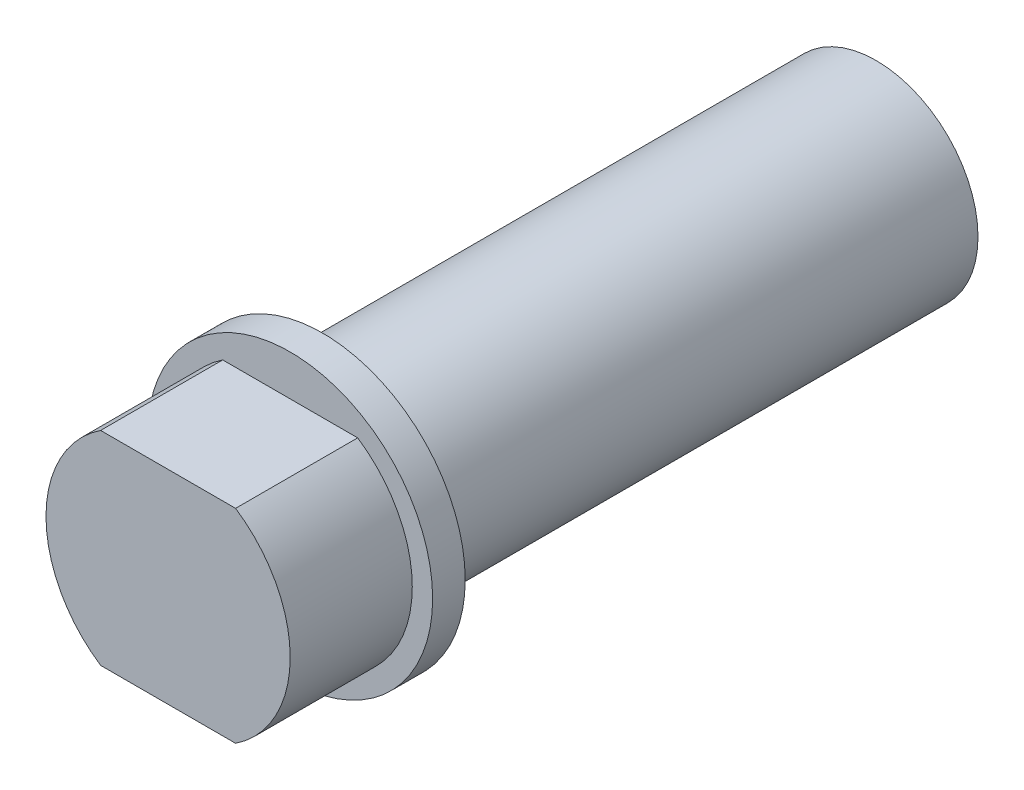
ISO-10303-21;
HEADER;
FILE_DESCRIPTION(('STEP AP214'),'2;1');
FILE_NAME('part.step','',(''),(''),'','','');
FILE_SCHEMA(('AUTOMOTIVE_DESIGN { 1 0 10303 214 1 1 1 1 }'));
ENDSEC;
DATA;
#1=APPLICATION_CONTEXT('core data for automotive mechanical design processes');
#2=APPLICATION_PROTOCOL_DEFINITION('international standard','automotive_design',2000,#1);
#3=PRODUCT_CONTEXT('',#1,'mechanical');
#4=PRODUCT('Part','Part','',(#3));
#5=PRODUCT_RELATED_PRODUCT_CATEGORY('part','',(#4));
#6=PRODUCT_DEFINITION_FORMATION('','',#4);
#7=PRODUCT_DEFINITION_CONTEXT('part definition',#1,'design');
#8=PRODUCT_DEFINITION('design','',#6,#7);
#9=PRODUCT_DEFINITION_SHAPE('','',#8);
#10=(LENGTH_UNIT() NAMED_UNIT(*) SI_UNIT(.MILLI.,.METRE.));
#11=(NAMED_UNIT(*) PLANE_ANGLE_UNIT() SI_UNIT($,.RADIAN.));
#12=(NAMED_UNIT(*) SI_UNIT($,.STERADIAN.) SOLID_ANGLE_UNIT());
#13=UNCERTAINTY_MEASURE_WITH_UNIT(LENGTH_MEASURE(1.E-05),#10,'distance_accuracy_value','');
#14=(GEOMETRIC_REPRESENTATION_CONTEXT(3) GLOBAL_UNCERTAINTY_ASSIGNED_CONTEXT((#13)) GLOBAL_UNIT_ASSIGNED_CONTEXT((#10,
#11,#12)) REPRESENTATION_CONTEXT('',''));
#15=CARTESIAN_POINT('',(0.,0.,0.));
#16=DIRECTION('',(0.,0.,1.));
#17=DIRECTION('',(1.,0.,0.));
#18=AXIS2_PLACEMENT_3D('',#15,#16,#17);
#19=CARTESIAN_POINT('',(0.,0.,68.));
#20=DIRECTION('',(0.,0.,-1.));
#21=DIRECTION('',(-1.,0.,0.));
#22=AXIS2_PLACEMENT_3D('',#19,#20,#21);
#23=CYLINDRICAL_SURFACE('',#22,12.5);
#24=CARTESIAN_POINT('',(0.,0.,68.));
#25=DIRECTION('',(0.,0.,1.));
#26=DIRECTION('',(1.,0.,0.));
#27=AXIS2_PLACEMENT_3D('',#24,#25,#26);
#28=CIRCLE('',#27,12.5);
#29=CARTESIAN_POINT('',(12.5,0.,68.));
#30=VERTEX_POINT('',#29);
#31=EDGE_CURVE('E101',#30,#30,#28,.T.);
#32=ORIENTED_EDGE('',*,*,#31,.F.);
#33=EDGE_LOOP('',(#32));
#34=FACE_BOUND('',#33,.T.);
#35=CARTESIAN_POINT('',(0.,0.,66.));
#36=DIRECTION('',(0.,0.,-1.));
#37=DIRECTION('',(-1.,0.,0.));
#38=AXIS2_PLACEMENT_3D('',#35,#36,#37);
#39=CIRCLE('',#38,12.5);
#40=CARTESIAN_POINT('',(-12.5,0.,66.));
#41=VERTEX_POINT('',#40);
#42=EDGE_CURVE('E120',#41,#41,#39,.T.);
#43=ORIENTED_EDGE('',*,*,#42,.F.);
#44=EDGE_LOOP('',(#43));
#45=FACE_BOUND('',#44,.T.);
#46=ADVANCED_FACE('F39',(#34,#45),#23,.T.);
#47=CARTESIAN_POINT('',(0.,0.,87.));
#48=DIRECTION('',(0.,0.,-1.));
#49=DIRECTION('',(-1.,0.,0.));
#50=AXIS2_PLACEMENT_3D('',#47,#48,#49);
#51=CYLINDRICAL_SURFACE('',#50,15.);
#52=DIRECTION('',(0.,0.,-1.));
#53=VECTOR('',#52,1.);
#54=CARTESIAN_POINT('',(8.2915619758885,12.5,87.));
#55=LINE('',#54,#53);
#56=CARTESIAN_POINT('',(8.2915619758885,12.5,87.));
#57=VERTEX_POINT('',#56);
#58=CARTESIAN_POINT('',(8.2915619758885,12.5,72.));
#59=VERTEX_POINT('',#58);
#60=EDGE_CURVE('E134',#57,#59,#55,.T.);
#61=ORIENTED_EDGE('',*,*,#60,.F.);
#62=CARTESIAN_POINT('',(0.,0.,87.));
#63=DIRECTION('',(0.,0.,1.));
#64=DIRECTION('',(1.,0.,0.));
#65=AXIS2_PLACEMENT_3D('',#62,#63,#64);
#66=CIRCLE('',#65,15.);
#67=CARTESIAN_POINT('',(8.2915619758885,-12.5,87.));
#68=VERTEX_POINT('',#67);
#69=EDGE_CURVE('E102',#68,#57,#66,.T.);
#70=ORIENTED_EDGE('',*,*,#69,.F.);
#71=DIRECTION('',(0.,0.,-1.));
#72=VECTOR('',#71,1.);
#73=CARTESIAN_POINT('',(8.2915619758885,-12.5,87.));
#74=LINE('',#73,#72);
#75=CARTESIAN_POINT('',(8.2915619758885,-12.5,72.));
#76=VERTEX_POINT('',#75);
#77=EDGE_CURVE('E87',#76,#68,#74,.F.);
#78=ORIENTED_EDGE('',*,*,#77,.F.);
#79=CARTESIAN_POINT('',(0.,0.,72.));
#80=DIRECTION('',(0.,0.,1.));
#81=DIRECTION('',(1.,0.,0.));
#82=AXIS2_PLACEMENT_3D('',#79,#80,#81);
#83=CIRCLE('',#82,15.);
#84=EDGE_CURVE('E96',#76,#59,#83,.T.);
#85=ORIENTED_EDGE('',*,*,#84,.T.);
#86=EDGE_LOOP('',(#61,#70,#78,#85));
#87=FACE_BOUND('',#86,.T.);
#88=ADVANCED_FACE('F142',(#87),#51,.T.);
#89=DIRECTION('',(0.,0.,-1.));
#90=VECTOR('',#89,1.);
#91=CARTESIAN_POINT('',(-8.2915619758885,12.5,87.));
#92=LINE('',#91,#90);
#93=CARTESIAN_POINT('',(-8.2915619758885,12.5,72.));
#94=VERTEX_POINT('',#93);
#95=CARTESIAN_POINT('',(-8.2915619758885,12.5,87.));
#96=VERTEX_POINT('',#95);
#97=EDGE_CURVE('E88',#94,#96,#92,.F.);
#98=ORIENTED_EDGE('',*,*,#97,.F.);
#99=CARTESIAN_POINT('',(-8.2915619758885,-12.5,72.));
#100=VERTEX_POINT('',#99);
#101=EDGE_CURVE('E94',#94,#100,#83,.T.);
#102=ORIENTED_EDGE('',*,*,#101,.T.);
#103=DIRECTION('',(0.,0.,-1.));
#104=VECTOR('',#103,1.);
#105=CARTESIAN_POINT('',(-8.2915619758885,-12.5,87.));
#106=LINE('',#105,#104);
#107=CARTESIAN_POINT('',(-8.2915619758885,-12.5,87.));
#108=VERTEX_POINT('',#107);
#109=EDGE_CURVE('E76',#108,#100,#106,.T.);
#110=ORIENTED_EDGE('',*,*,#109,.F.);
#111=EDGE_CURVE('E114',#96,#108,#66,.T.);
#112=ORIENTED_EDGE('',*,*,#111,.F.);
#113=EDGE_LOOP('',(#98,#102,#110,#112));
#114=FACE_BOUND('',#113,.T.);
#115=ADVANCED_FACE('F98',(#114),#51,.T.);
#116=CARTESIAN_POINT('',(0.,0.,72.));
#117=DIRECTION('',(0.,0.,-1.));
#118=DIRECTION('',(-1.,0.,0.));
#119=AXIS2_PLACEMENT_3D('',#116,#117,#118);
#120=CYLINDRICAL_SURFACE('',#119,17.5);
#121=CARTESIAN_POINT('',(0.,0.,72.));
#122=DIRECTION('',(0.,0.,1.));
#123=DIRECTION('',(1.,0.,0.));
#124=AXIS2_PLACEMENT_3D('',#121,#122,#123);
#125=CIRCLE('',#124,17.5);
#126=CARTESIAN_POINT('',(17.5,0.,72.));
#127=VERTEX_POINT('',#126);
#128=EDGE_CURVE('E106',#127,#127,#125,.T.);
#129=ORIENTED_EDGE('',*,*,#128,.F.);
#130=EDGE_LOOP('',(#129));
#131=FACE_BOUND('',#130,.T.);
#132=CARTESIAN_POINT('',(0.,0.,68.));
#133=DIRECTION('',(0.,0.,1.));
#134=DIRECTION('',(1.,0.,0.));
#135=AXIS2_PLACEMENT_3D('',#132,#133,#134);
#136=CIRCLE('',#135,17.5);
#137=CARTESIAN_POINT('',(17.5,0.,68.));
#138=VERTEX_POINT('',#137);
#139=EDGE_CURVE('E109',#138,#138,#136,.T.);
#140=ORIENTED_EDGE('',*,*,#139,.T.);
#141=EDGE_LOOP('',(#140));
#142=FACE_BOUND('',#141,.T.);
#143=ADVANCED_FACE('F149',(#131,#142),#120,.T.);
#144=CARTESIAN_POINT('',(0.,0.,72.));
#145=DIRECTION('',(0.,0.,1.));
#146=DIRECTION('',(1.,0.,0.));
#147=AXIS2_PLACEMENT_3D('',#144,#145,#146);
#148=PLANE('',#147);
#149=ORIENTED_EDGE('',*,*,#101,.F.);
#150=DIRECTION('',(1.,0.,0.));
#151=VECTOR('',#150,1.);
#152=CARTESIAN_POINT('',(-16.,12.5,72.));
#153=LINE('',#152,#151);
#154=EDGE_CURVE('E61',#94,#59,#153,.T.);
#155=ORIENTED_EDGE('',*,*,#154,.T.);
#156=ORIENTED_EDGE('',*,*,#84,.F.);
#157=DIRECTION('',(-1.,0.,0.));
#158=VECTOR('',#157,1.);
#159=CARTESIAN_POINT('',(-16.,-12.5,72.));
#160=LINE('',#159,#158);
#161=EDGE_CURVE('E57',#76,#100,#160,.T.);
#162=ORIENTED_EDGE('',*,*,#161,.T.);
#163=EDGE_LOOP('',(#149,#155,#156,#162));
#164=FACE_BOUND('',#163,.T.);
#165=ORIENTED_EDGE('',*,*,#128,.T.);
#166=EDGE_LOOP('',(#165));
#167=FACE_BOUND('',#166,.T.);
#168=ADVANCED_FACE('F95',(#164,#167),#148,.T.);
#169=CARTESIAN_POINT('',(0.,0.,68.));
#170=DIRECTION('',(0.,0.,1.));
#171=DIRECTION('',(1.,0.,0.));
#172=AXIS2_PLACEMENT_3D('',#169,#170,#171);
#173=PLANE('',#172);
#174=ORIENTED_EDGE('',*,*,#31,.T.);
#175=EDGE_LOOP('',(#174));
#176=FACE_BOUND('',#175,.T.);
#177=ORIENTED_EDGE('',*,*,#139,.F.);
#178=EDGE_LOOP('',(#177));
#179=FACE_BOUND('',#178,.T.);
#180=ADVANCED_FACE('F160',(#176,#179),#173,.F.);
#181=CARTESIAN_POINT('',(0.,0.,87.));
#182=DIRECTION('',(0.,0.,1.));
#183=DIRECTION('',(1.,0.,0.));
#184=AXIS2_PLACEMENT_3D('',#181,#182,#183);
#185=PLANE('',#184);
#186=DIRECTION('',(1.,0.,0.));
#187=VECTOR('',#186,1.);
#188=CARTESIAN_POINT('',(-16.,12.5,87.));
#189=LINE('',#188,#187);
#190=EDGE_CURVE('E11',#96,#57,#189,.T.);
#191=ORIENTED_EDGE('',*,*,#190,.F.);
#192=ORIENTED_EDGE('',*,*,#111,.T.);
#193=DIRECTION('',(-1.,0.,0.));
#194=VECTOR('',#193,1.);
#195=CARTESIAN_POINT('',(-16.,-12.5,87.));
#196=LINE('',#195,#194);
#197=EDGE_CURVE('E48',#68,#108,#196,.T.);
#198=ORIENTED_EDGE('',*,*,#197,.F.);
#199=ORIENTED_EDGE('',*,*,#69,.T.);
#200=EDGE_LOOP('',(#191,#192,#198,#199));
#201=FACE_BOUND('',#200,.T.);
#202=ADVANCED_FACE('F137',(#201),#185,.T.);
#203=CARTESIAN_POINT('',(-16.,-12.5,87.));
#204=DIRECTION('',(0.,-1.,0.));
#205=DIRECTION('',(0.,0.,-1.));
#206=AXIS2_PLACEMENT_3D('',#203,#204,#205);
#207=PLANE('',#206);
#208=ORIENTED_EDGE('',*,*,#109,.T.);
#209=ORIENTED_EDGE('',*,*,#161,.F.);
#210=ORIENTED_EDGE('',*,*,#77,.T.);
#211=ORIENTED_EDGE('',*,*,#197,.T.);
#212=EDGE_LOOP('',(#208,#209,#210,#211));
#213=FACE_BOUND('',#212,.T.);
#214=ADVANCED_FACE('F78',(#213),#207,.T.);
#215=CARTESIAN_POINT('',(-16.,12.5,87.));
#216=DIRECTION('',(0.,1.,0.));
#217=DIRECTION('',(0.,0.,1.));
#218=AXIS2_PLACEMENT_3D('',#215,#216,#217);
#219=PLANE('',#218);
#220=ORIENTED_EDGE('',*,*,#60,.T.);
#221=ORIENTED_EDGE('',*,*,#154,.F.);
#222=ORIENTED_EDGE('',*,*,#97,.T.);
#223=ORIENTED_EDGE('',*,*,#190,.T.);
#224=EDGE_LOOP('',(#220,#221,#222,#223));
#225=FACE_BOUND('',#224,.T.);
#226=ADVANCED_FACE('F139',(#225),#219,.T.);
#227=CARTESIAN_POINT('',(0.,11.5,65.));
#228=DIRECTION('',(0.,0.,1.));
#229=DIRECTION('',(1.,0.,0.));
#230=AXIS2_PLACEMENT_3D('',#227,#228,#229);
#231=PLANE('',#230);
#232=CARTESIAN_POINT('',(0.,0.,65.));
#233=DIRECTION('',(0.,0.,1.));
#234=DIRECTION('',(1.,0.,0.));
#235=AXIS2_PLACEMENT_3D('',#232,#233,#234);
#236=CIRCLE('',#235,11.5);
#237=CARTESIAN_POINT('',(11.5,0.,65.));
#238=VERTEX_POINT('',#237);
#239=EDGE_CURVE('E122',#238,#238,#236,.T.);
#240=ORIENTED_EDGE('',*,*,#239,.F.);
#241=EDGE_LOOP('',(#240));
#242=FACE_BOUND('',#241,.T.);
#243=CARTESIAN_POINT('',(0.,0.,65.));
#244=DIRECTION('',(0.,0.,1.));
#245=DIRECTION('',(1.,0.,0.));
#246=AXIS2_PLACEMENT_3D('',#243,#244,#245);
#247=CIRCLE('',#246,12.5);
#248=CARTESIAN_POINT('',(12.5,0.,65.));
#249=VERTEX_POINT('',#248);
#250=EDGE_CURVE('E43',#249,#249,#247,.T.);
#251=ORIENTED_EDGE('',*,*,#250,.T.);
#252=EDGE_LOOP('',(#251));
#253=FACE_BOUND('',#252,.T.);
#254=ADVANCED_FACE('F176',(#242,#253),#231,.T.);
#255=CARTESIAN_POINT('',(0.,11.5,66.));
#256=DIRECTION('',(0.,0.,-1.));
#257=DIRECTION('',(-1.,0.,0.));
#258=AXIS2_PLACEMENT_3D('',#255,#256,#257);
#259=PLANE('',#258);
#260=CARTESIAN_POINT('',(0.,0.,66.));
#261=DIRECTION('',(0.,0.,1.));
#262=DIRECTION('',(1.,0.,0.));
#263=AXIS2_PLACEMENT_3D('',#260,#261,#262);
#264=CIRCLE('',#263,11.5);
#265=CARTESIAN_POINT('',(11.5,0.,66.));
#266=VERTEX_POINT('',#265);
#267=EDGE_CURVE('E116',#266,#266,#264,.T.);
#268=ORIENTED_EDGE('',*,*,#267,.T.);
#269=EDGE_LOOP('',(#268));
#270=FACE_BOUND('',#269,.T.);
#271=ORIENTED_EDGE('',*,*,#42,.T.);
#272=EDGE_LOOP('',(#271));
#273=FACE_BOUND('',#272,.T.);
#274=ADVANCED_FACE('F172',(#270,#273),#259,.T.);
#275=CARTESIAN_POINT('',(0.,0.,90.));
#276=DIRECTION('',(0.,0.,1.));
#277=DIRECTION('',(1.,0.,0.));
#278=AXIS2_PLACEMENT_3D('',#275,#276,#277);
#279=CYLINDRICAL_SURFACE('',#278,11.5);
#280=ORIENTED_EDGE('',*,*,#239,.T.);
#281=EDGE_LOOP('',(#280));
#282=FACE_BOUND('',#281,.T.);
#283=ORIENTED_EDGE('',*,*,#267,.F.);
#284=EDGE_LOOP('',(#283));
#285=FACE_BOUND('',#284,.T.);
#286=ADVANCED_FACE('F163',(#282,#285),#279,.T.);
#287=CARTESIAN_POINT('',(0.,0.,0.));
#288=DIRECTION('',(0.,0.,1.));
#289=DIRECTION('',(1.,0.,0.));
#290=AXIS2_PLACEMENT_3D('',#287,#288,#289);
#291=PLANE('',#290);
#292=CARTESIAN_POINT('',(0.,0.,0.));
#293=DIRECTION('',(0.,0.,1.));
#294=DIRECTION('',(1.,0.,0.));
#295=AXIS2_PLACEMENT_3D('',#292,#293,#294);
#296=CIRCLE('',#295,12.5);
#297=CARTESIAN_POINT('',(12.5,0.,0.));
#298=VERTEX_POINT('',#297);
#299=EDGE_CURVE('E108',#298,#298,#296,.T.);
#300=ORIENTED_EDGE('',*,*,#299,.F.);
#301=EDGE_LOOP('',(#300));
#302=FACE_BOUND('',#301,.T.);
#303=ADVANCED_FACE('F165',(#302),#291,.F.);
#304=ORIENTED_EDGE('',*,*,#299,.T.);
#305=EDGE_LOOP('',(#304));
#306=FACE_BOUND('',#305,.T.);
#307=ORIENTED_EDGE('',*,*,#250,.F.);
#308=EDGE_LOOP('',(#307));
#309=FACE_BOUND('',#308,.T.);
#310=ADVANCED_FACE('F41',(#306,#309),#23,.T.);
#311=CLOSED_SHELL('',(#46,#88,#115,#143,#168,#180,#202,#214,#226,#254,#274,#286,#303,#310));
#312=MANIFOLD_SOLID_BREP('B2',#311);
#313=ADVANCED_BREP_SHAPE_REPRESENTATION('',(#18,#312),#14);
#314=SHAPE_DEFINITION_REPRESENTATION(#9,#313);
ENDSEC;
END-ISO-10303-21;
